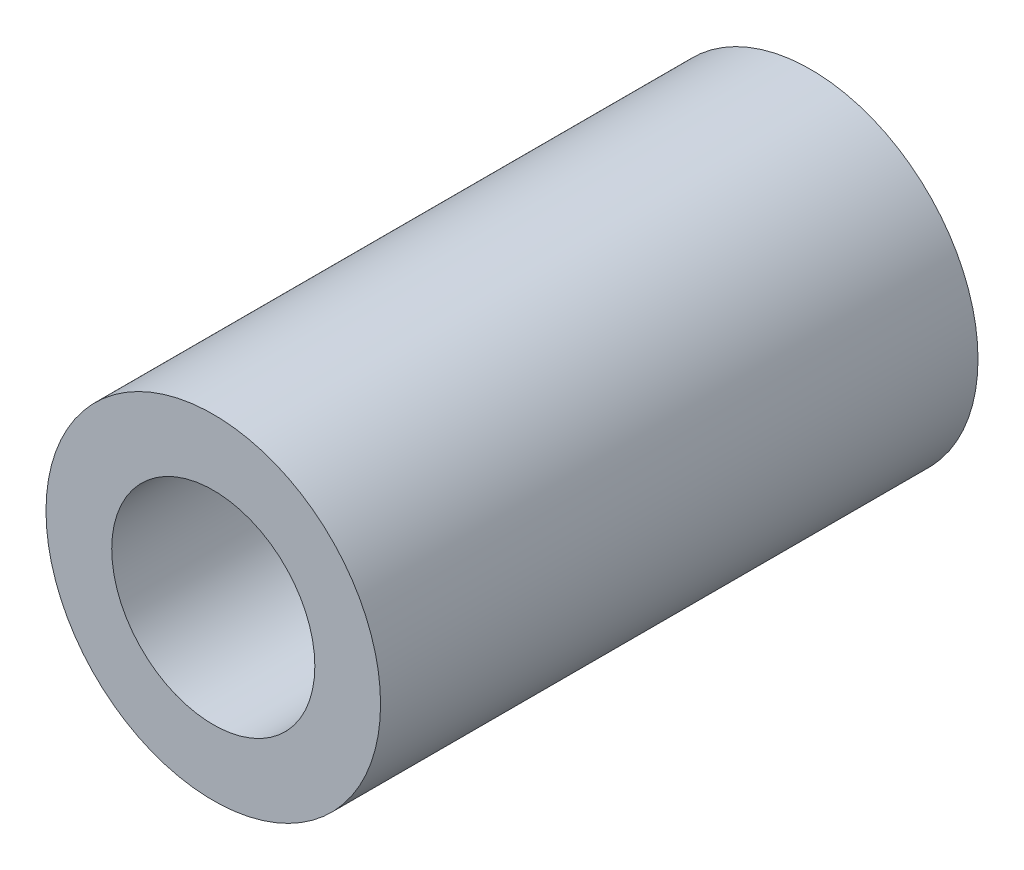
ISO-10303-21;
HEADER;
FILE_DESCRIPTION(('STEP AP214'),'2;1');
FILE_NAME('part.step','',(''),(''),'','','');
FILE_SCHEMA(('AUTOMOTIVE_DESIGN { 1 0 10303 214 1 1 1 1 }'));
ENDSEC;
DATA;
#1=APPLICATION_CONTEXT('core data for automotive mechanical design processes');
#2=APPLICATION_PROTOCOL_DEFINITION('international standard','automotive_design',2000,#1);
#3=PRODUCT_CONTEXT('',#1,'mechanical');
#4=PRODUCT('Part','Part','',(#3));
#5=PRODUCT_RELATED_PRODUCT_CATEGORY('part','',(#4));
#6=PRODUCT_DEFINITION_FORMATION('','',#4);
#7=PRODUCT_DEFINITION_CONTEXT('part definition',#1,'design');
#8=PRODUCT_DEFINITION('design','',#6,#7);
#9=PRODUCT_DEFINITION_SHAPE('','',#8);
#10=(LENGTH_UNIT() NAMED_UNIT(*) SI_UNIT(.MILLI.,.METRE.));
#11=(NAMED_UNIT(*) PLANE_ANGLE_UNIT() SI_UNIT($,.RADIAN.));
#12=(NAMED_UNIT(*) SI_UNIT($,.STERADIAN.) SOLID_ANGLE_UNIT());
#13=UNCERTAINTY_MEASURE_WITH_UNIT(LENGTH_MEASURE(1.E-05),#10,'distance_accuracy_value','');
#14=(GEOMETRIC_REPRESENTATION_CONTEXT(3) GLOBAL_UNCERTAINTY_ASSIGNED_CONTEXT((#13)) GLOBAL_UNIT_ASSIGNED_CONTEXT((#10,
#11,#12)) REPRESENTATION_CONTEXT('',''));
#15=CARTESIAN_POINT('',(0.,0.,0.));
#16=DIRECTION('',(0.,0.,1.));
#17=DIRECTION('',(1.,0.,0.));
#18=AXIS2_PLACEMENT_3D('',#15,#16,#17);
#19=CARTESIAN_POINT('',(0.,0.,25.));
#20=DIRECTION('',(0.,0.,1.));
#21=DIRECTION('',(1.,0.,0.));
#22=AXIS2_PLACEMENT_3D('',#19,#20,#21);
#23=PLANE('',#22);
#24=CARTESIAN_POINT('',(0.,0.,25.));
#25=DIRECTION('',(0.,0.,1.));
#26=DIRECTION('',(1.,0.,0.));
#27=AXIS2_PLACEMENT_3D('',#24,#25,#26);
#28=CIRCLE('',#27,7.);
#29=CARTESIAN_POINT('',(7.,0.,25.));
#30=VERTEX_POINT('',#29);
#31=EDGE_CURVE('E10',#30,#30,#28,.T.);
#32=ORIENTED_EDGE('',*,*,#31,.T.);
#33=EDGE_LOOP('',(#32));
#34=FACE_BOUND('',#33,.T.);
#35=CARTESIAN_POINT('',(0.,0.,25.));
#36=DIRECTION('',(0.,0.,1.));
#37=DIRECTION('',(1.,0.,0.));
#38=AXIS2_PLACEMENT_3D('',#35,#36,#37);
#39=CIRCLE('',#38,4.25);
#40=CARTESIAN_POINT('',(4.25,0.,25.));
#41=VERTEX_POINT('',#40);
#42=EDGE_CURVE('E54',#41,#41,#39,.T.);
#43=ORIENTED_EDGE('',*,*,#42,.F.);
#44=EDGE_LOOP('',(#43));
#45=FACE_BOUND('',#44,.T.);
#46=ADVANCED_FACE('F41',(#34,#45),#23,.T.);
#47=CARTESIAN_POINT('',(0.,0.,0.));
#48=DIRECTION('',(0.,0.,1.));
#49=DIRECTION('',(1.,0.,0.));
#50=AXIS2_PLACEMENT_3D('',#47,#48,#49);
#51=PLANE('',#50);
#52=CARTESIAN_POINT('',(0.,0.,0.));
#53=DIRECTION('',(0.,0.,1.));
#54=DIRECTION('',(1.,0.,0.));
#55=AXIS2_PLACEMENT_3D('',#52,#53,#54);
#56=CIRCLE('',#55,7.);
#57=CARTESIAN_POINT('',(7.,0.,0.));
#58=VERTEX_POINT('',#57);
#59=EDGE_CURVE('E45',#58,#58,#56,.T.);
#60=ORIENTED_EDGE('',*,*,#59,.F.);
#61=EDGE_LOOP('',(#60));
#62=FACE_BOUND('',#61,.T.);
#63=CARTESIAN_POINT('',(0.,0.,0.));
#64=DIRECTION('',(0.,0.,1.));
#65=DIRECTION('',(1.,0.,0.));
#66=AXIS2_PLACEMENT_3D('',#63,#64,#65);
#67=CIRCLE('',#66,4.25);
#68=CARTESIAN_POINT('',(4.25,0.,0.));
#69=VERTEX_POINT('',#68);
#70=EDGE_CURVE('E56',#69,#69,#67,.T.);
#71=ORIENTED_EDGE('',*,*,#70,.T.);
#72=EDGE_LOOP('',(#71));
#73=FACE_BOUND('',#72,.T.);
#74=ADVANCED_FACE('F68',(#62,#73),#51,.F.);
#75=CARTESIAN_POINT('',(0.,0.,25.));
#76=DIRECTION('',(0.,0.,-1.));
#77=DIRECTION('',(-1.,0.,0.));
#78=AXIS2_PLACEMENT_3D('',#75,#76,#77);
#79=CYLINDRICAL_SURFACE('',#78,7.);
#80=ORIENTED_EDGE('',*,*,#31,.F.);
#81=EDGE_LOOP('',(#80));
#82=FACE_BOUND('',#81,.T.);
#83=ORIENTED_EDGE('',*,*,#59,.T.);
#84=EDGE_LOOP('',(#83));
#85=FACE_BOUND('',#84,.T.);
#86=ADVANCED_FACE('F43',(#82,#85),#79,.T.);
#87=CARTESIAN_POINT('',(0.,0.,25.));
#88=DIRECTION('',(0.,0.,-1.));
#89=DIRECTION('',(-1.,0.,0.));
#90=AXIS2_PLACEMENT_3D('',#87,#88,#89);
#91=CYLINDRICAL_SURFACE('',#90,4.25);
#92=ORIENTED_EDGE('',*,*,#42,.T.);
#93=EDGE_LOOP('',(#92));
#94=FACE_BOUND('',#93,.T.);
#95=ORIENTED_EDGE('',*,*,#70,.F.);
#96=EDGE_LOOP('',(#95));
#97=FACE_BOUND('',#96,.T.);
#98=ADVANCED_FACE('F64',(#94,#97),#91,.F.);
#99=CLOSED_SHELL('',(#46,#74,#86,#98));
#100=MANIFOLD_SOLID_BREP('B2',#99);
#101=ADVANCED_BREP_SHAPE_REPRESENTATION('',(#18,#100),#14);
#102=SHAPE_DEFINITION_REPRESENTATION(#9,#101);
ENDSEC;
END-ISO-10303-21;
